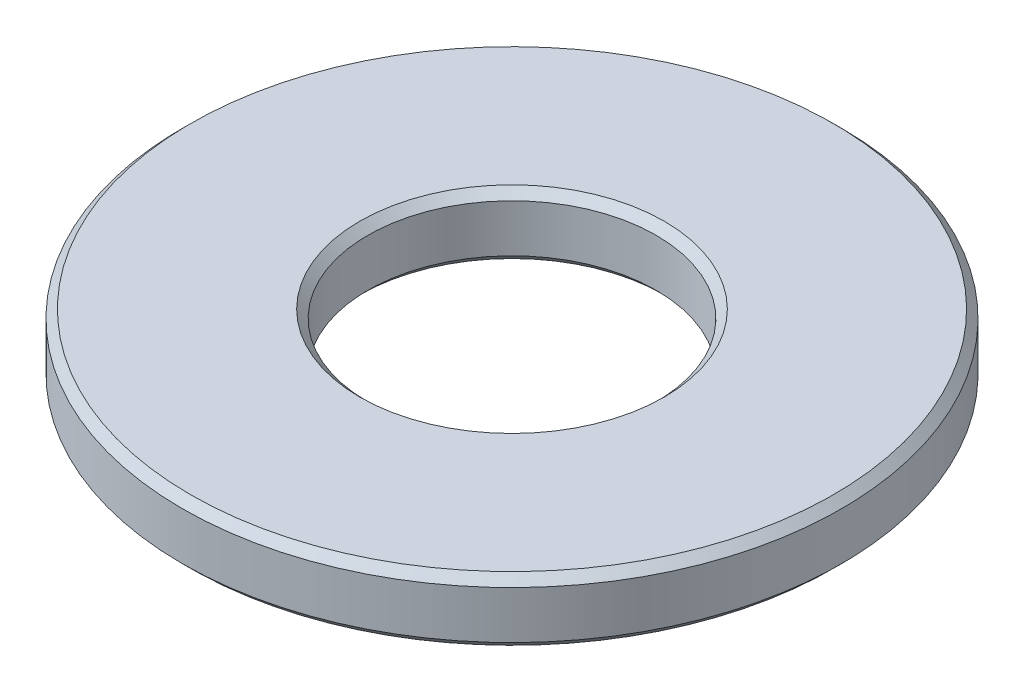
ISO-10303-21;
HEADER;
FILE_DESCRIPTION(('STEP AP214'),'2;1');
FILE_NAME('part.step','',(''),(''),'','','');
FILE_SCHEMA(('AUTOMOTIVE_DESIGN { 1 0 10303 214 1 1 1 1 }'));
ENDSEC;
DATA;
#1=APPLICATION_CONTEXT('core data for automotive mechanical design processes');
#2=APPLICATION_PROTOCOL_DEFINITION('international standard','automotive_design',2000,#1);
#3=PRODUCT_CONTEXT('',#1,'mechanical');
#4=PRODUCT('Part','Part','',(#3));
#5=PRODUCT_RELATED_PRODUCT_CATEGORY('part','',(#4));
#6=PRODUCT_DEFINITION_FORMATION('','',#4);
#7=PRODUCT_DEFINITION_CONTEXT('part definition',#1,'design');
#8=PRODUCT_DEFINITION('design','',#6,#7);
#9=PRODUCT_DEFINITION_SHAPE('','',#8);
#10=(LENGTH_UNIT() NAMED_UNIT(*) SI_UNIT(.MILLI.,.METRE.));
#11=(NAMED_UNIT(*) PLANE_ANGLE_UNIT() SI_UNIT($,.RADIAN.));
#12=(NAMED_UNIT(*) SI_UNIT($,.STERADIAN.) SOLID_ANGLE_UNIT());
#13=UNCERTAINTY_MEASURE_WITH_UNIT(LENGTH_MEASURE(1.E-05),#10,'distance_accuracy_value','');
#14=(GEOMETRIC_REPRESENTATION_CONTEXT(3) GLOBAL_UNCERTAINTY_ASSIGNED_CONTEXT((#13)) GLOBAL_UNIT_ASSIGNED_CONTEXT((#10,
#11,#12)) REPRESENTATION_CONTEXT('',''));
#15=CARTESIAN_POINT('',(0.,0.,0.));
#16=DIRECTION('',(0.,0.,1.));
#17=DIRECTION('',(1.,0.,0.));
#18=AXIS2_PLACEMENT_3D('',#15,#16,#17);
#19=CARTESIAN_POINT('',(3.556,0.,0.));
#20=DIRECTION('',(0.,1.,0.));
#21=DIRECTION('',(0.,0.,1.));
#22=AXIS2_PLACEMENT_3D('',#19,#20,#21);
#23=PLANE('',#22);
#24=CARTESIAN_POINT('',(0.,0.,0.));
#25=DIRECTION('',(0.,1.,0.));
#26=DIRECTION('',(0.,0.,1.));
#27=AXIS2_PLACEMENT_3D('',#24,#25,#26);
#28=CIRCLE('',#27,3.756);
#29=CARTESIAN_POINT('',(0.,0.,3.756));
#30=VERTEX_POINT('',#29);
#31=EDGE_CURVE('E10',#30,#30,#28,.F.);
#32=ORIENTED_EDGE('',*,*,#31,.T.);
#33=EDGE_LOOP('',(#32));
#34=FACE_BOUND('',#33,.T.);
#35=CARTESIAN_POINT('',(0.,0.,0.));
#36=DIRECTION('',(0.,1.,0.));
#37=DIRECTION('',(0.,0.,1.));
#38=AXIS2_PLACEMENT_3D('',#35,#36,#37);
#39=CIRCLE('',#38,7.928);
#40=CARTESIAN_POINT('',(0.,0.,7.928));
#41=VERTEX_POINT('',#40);
#42=EDGE_CURVE('E38',#41,#41,#39,.T.);
#43=ORIENTED_EDGE('',*,*,#42,.T.);
#44=EDGE_LOOP('',(#43));
#45=FACE_BOUND('',#44,.T.);
#46=ADVANCED_FACE('F31',(#34,#45),#23,.T.);
#47=CARTESIAN_POINT('',(0.,-1.5748,0.));
#48=DIRECTION('',(0.,1.,0.));
#49=DIRECTION('',(0.,0.,1.));
#50=AXIS2_PLACEMENT_3D('',#47,#48,#49);
#51=CYLINDRICAL_SURFACE('',#50,8.128);
#52=CARTESIAN_POINT('',(0.,-1.3748,0.));
#53=DIRECTION('',(0.,-1.,0.));
#54=DIRECTION('',(0.,0.,-1.));
#55=AXIS2_PLACEMENT_3D('',#52,#53,#54);
#56=CIRCLE('',#55,8.128);
#57=CARTESIAN_POINT('',(0.,-1.3748,-8.128));
#58=VERTEX_POINT('',#57);
#59=EDGE_CURVE('E57',#58,#58,#56,.F.);
#60=ORIENTED_EDGE('',*,*,#59,.T.);
#61=EDGE_LOOP('',(#60));
#62=FACE_BOUND('',#61,.T.);
#63=CARTESIAN_POINT('',(0.,-0.199999999999999,0.));
#64=DIRECTION('',(0.,1.,0.));
#65=DIRECTION('',(0.,0.,1.));
#66=AXIS2_PLACEMENT_3D('',#63,#64,#65);
#67=CIRCLE('',#66,8.128);
#68=CARTESIAN_POINT('',(0.,-0.199999999999999,8.128));
#69=VERTEX_POINT('',#68);
#70=EDGE_CURVE('E60',#69,#69,#67,.F.);
#71=ORIENTED_EDGE('',*,*,#70,.T.);
#72=EDGE_LOOP('',(#71));
#73=FACE_BOUND('',#72,.T.);
#74=ADVANCED_FACE('F64',(#62,#73),#51,.T.);
#75=CARTESIAN_POINT('',(8.128,-1.5748,0.));
#76=DIRECTION('',(0.,-1.,0.));
#77=DIRECTION('',(0.,0.,-1.));
#78=AXIS2_PLACEMENT_3D('',#75,#76,#77);
#79=PLANE('',#78);
#80=CARTESIAN_POINT('',(0.,-1.5748,0.));
#81=DIRECTION('',(0.,-1.,0.));
#82=DIRECTION('',(0.,0.,-1.));
#83=AXIS2_PLACEMENT_3D('',#80,#81,#82);
#84=CIRCLE('',#83,7.928);
#85=CARTESIAN_POINT('',(0.,-1.5748,-7.928));
#86=VERTEX_POINT('',#85);
#87=EDGE_CURVE('E51',#86,#86,#84,.T.);
#88=ORIENTED_EDGE('',*,*,#87,.T.);
#89=EDGE_LOOP('',(#88));
#90=FACE_BOUND('',#89,.T.);
#91=CARTESIAN_POINT('',(0.,-1.5748,0.));
#92=DIRECTION('',(0.,-1.,0.));
#93=DIRECTION('',(0.,0.,-1.));
#94=AXIS2_PLACEMENT_3D('',#91,#92,#93);
#95=CIRCLE('',#94,3.75600000000001);
#96=CARTESIAN_POINT('',(0.,-1.5748,-3.75600000000001));
#97=VERTEX_POINT('',#96);
#98=EDGE_CURVE('E54',#97,#97,#95,.F.);
#99=ORIENTED_EDGE('',*,*,#98,.T.);
#100=EDGE_LOOP('',(#99));
#101=FACE_BOUND('',#100,.T.);
#102=ADVANCED_FACE('F79',(#90,#101),#79,.T.);
#103=CARTESIAN_POINT('',(0.,-1.5748,0.));
#104=DIRECTION('',(0.,1.,0.));
#105=DIRECTION('',(0.,0.,1.));
#106=AXIS2_PLACEMENT_3D('',#103,#104,#105);
#107=CYLINDRICAL_SURFACE('',#106,3.556);
#108=CARTESIAN_POINT('',(0.,-1.37479999999999,0.));
#109=DIRECTION('',(0.,-1.,0.));
#110=DIRECTION('',(0.,0.,-1.));
#111=AXIS2_PLACEMENT_3D('',#108,#109,#110);
#112=CIRCLE('',#111,3.556);
#113=CARTESIAN_POINT('',(0.,-1.37479999999999,-3.556));
#114=VERTEX_POINT('',#113);
#115=EDGE_CURVE('E42',#114,#114,#112,.T.);
#116=ORIENTED_EDGE('',*,*,#115,.T.);
#117=EDGE_LOOP('',(#116));
#118=FACE_BOUND('',#117,.T.);
#119=CARTESIAN_POINT('',(0.,-0.199999999999997,0.));
#120=DIRECTION('',(0.,1.,0.));
#121=DIRECTION('',(0.,0.,1.));
#122=AXIS2_PLACEMENT_3D('',#119,#120,#121);
#123=CIRCLE('',#122,3.556);
#124=CARTESIAN_POINT('',(0.,-0.199999999999997,3.556));
#125=VERTEX_POINT('',#124);
#126=EDGE_CURVE('E46',#125,#125,#123,.T.);
#127=ORIENTED_EDGE('',*,*,#126,.T.);
#128=EDGE_LOOP('',(#127));
#129=FACE_BOUND('',#128,.T.);
#130=ADVANCED_FACE('F87',(#118,#129),#107,.F.);
#131=CARTESIAN_POINT('',(0.,-1.3748,0.));
#132=DIRECTION('',(0.,1.,0.));
#133=DIRECTION('',(0.,0.,1.));
#134=AXIS2_PLACEMENT_3D('',#131,#132,#133);
#135=CONICAL_SURFACE('',#134,8.128,0.785398163397448);
#136=ORIENTED_EDGE('',*,*,#87,.F.);
#137=EDGE_LOOP('',(#136));
#138=FACE_BOUND('',#137,.T.);
#139=ORIENTED_EDGE('',*,*,#59,.F.);
#140=EDGE_LOOP('',(#139));
#141=FACE_BOUND('',#140,.T.);
#142=ADVANCED_FACE('F84',(#138,#141),#135,.T.);
#143=CARTESIAN_POINT('',(0.,-1.5748,0.));
#144=DIRECTION('',(0.,-1.,0.));
#145=DIRECTION('',(0.,0.,-1.));
#146=AXIS2_PLACEMENT_3D('',#143,#144,#145);
#147=CONICAL_SURFACE('',#146,3.75600000000001,0.785398163397444);
#148=ORIENTED_EDGE('',*,*,#115,.F.);
#149=EDGE_LOOP('',(#148));
#150=FACE_BOUND('',#149,.T.);
#151=ORIENTED_EDGE('',*,*,#98,.F.);
#152=EDGE_LOOP('',(#151));
#153=FACE_BOUND('',#152,.T.);
#154=ADVANCED_FACE('F72',(#150,#153),#147,.F.);
#155=CARTESIAN_POINT('',(0.,-0.199999999999997,0.));
#156=DIRECTION('',(0.,1.,0.));
#157=DIRECTION('',(0.,0.,1.));
#158=AXIS2_PLACEMENT_3D('',#155,#156,#157);
#159=CONICAL_SURFACE('',#158,3.556,0.785398163397451);
#160=ORIENTED_EDGE('',*,*,#31,.F.);
#161=EDGE_LOOP('',(#160));
#162=FACE_BOUND('',#161,.T.);
#163=ORIENTED_EDGE('',*,*,#126,.F.);
#164=EDGE_LOOP('',(#163));
#165=FACE_BOUND('',#164,.T.);
#166=ADVANCED_FACE('F68',(#162,#165),#159,.F.);
#167=CARTESIAN_POINT('',(0.,0.,0.));
#168=DIRECTION('',(0.,-1.,0.));
#169=DIRECTION('',(0.,0.,-1.));
#170=AXIS2_PLACEMENT_3D('',#167,#168,#169);
#171=CONICAL_SURFACE('',#170,7.928,0.785398163397457);
#172=ORIENTED_EDGE('',*,*,#70,.F.);
#173=EDGE_LOOP('',(#172));
#174=FACE_BOUND('',#173,.T.);
#175=ORIENTED_EDGE('',*,*,#42,.F.);
#176=EDGE_LOOP('',(#175));
#177=FACE_BOUND('',#176,.T.);
#178=ADVANCED_FACE('F33',(#174,#177),#171,.T.);
#179=CLOSED_SHELL('',(#46,#74,#102,#130,#142,#154,#166,#178));
#180=MANIFOLD_SOLID_BREP('B2',#179);
#181=ADVANCED_BREP_SHAPE_REPRESENTATION('',(#18,#180),#14);
#182=SHAPE_DEFINITION_REPRESENTATION(#9,#181);
ENDSEC;
END-ISO-10303-21;
